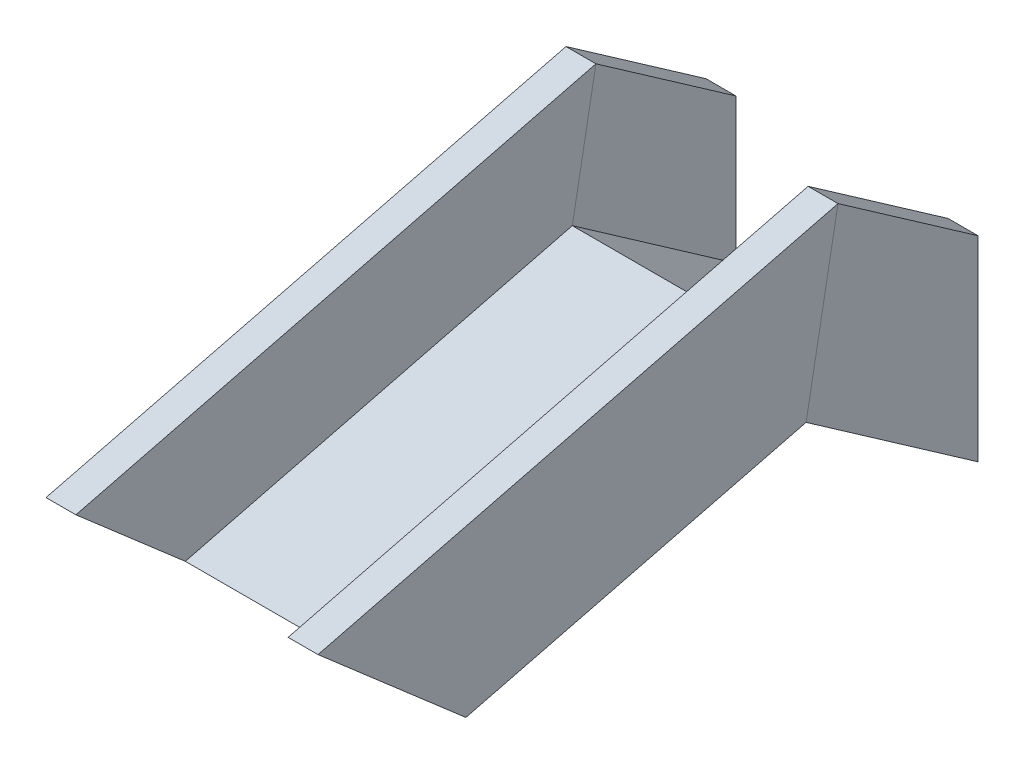
ISO-10303-21;
HEADER;
FILE_DESCRIPTION(('STEP AP214'),'2;1');
FILE_NAME('part.step','',(''),(''),'','','');
FILE_SCHEMA(('AUTOMOTIVE_DESIGN { 1 0 10303 214 1 1 1 1 }'));
ENDSEC;
DATA;
#1=APPLICATION_CONTEXT('core data for automotive mechanical design processes');
#2=APPLICATION_PROTOCOL_DEFINITION('international standard','automotive_design',2000,#1);
#3=PRODUCT_CONTEXT('',#1,'mechanical');
#4=PRODUCT('Part','Part','',(#3));
#5=PRODUCT_RELATED_PRODUCT_CATEGORY('part','',(#4));
#6=PRODUCT_DEFINITION_FORMATION('','',#4);
#7=PRODUCT_DEFINITION_CONTEXT('part definition',#1,'design');
#8=PRODUCT_DEFINITION('design','',#6,#7);
#9=PRODUCT_DEFINITION_SHAPE('','',#8);
#10=(LENGTH_UNIT() NAMED_UNIT(*) SI_UNIT(.MILLI.,.METRE.));
#11=(NAMED_UNIT(*) PLANE_ANGLE_UNIT() SI_UNIT($,.RADIAN.));
#12=(NAMED_UNIT(*) SI_UNIT($,.STERADIAN.) SOLID_ANGLE_UNIT());
#13=UNCERTAINTY_MEASURE_WITH_UNIT(LENGTH_MEASURE(1.E-05),#10,'distance_accuracy_value','');
#14=(GEOMETRIC_REPRESENTATION_CONTEXT(3) GLOBAL_UNCERTAINTY_ASSIGNED_CONTEXT((#13)) GLOBAL_UNIT_ASSIGNED_CONTEXT((#10,
#11,#12)) REPRESENTATION_CONTEXT('',''));
#15=CARTESIAN_POINT('',(0.,0.,0.));
#16=DIRECTION('',(0.,0.,1.));
#17=DIRECTION('',(1.,0.,0.));
#18=AXIS2_PLACEMENT_3D('',#15,#16,#17);
#19=CARTESIAN_POINT('',(0.,6.4741898096301,95.6456803790289));
#20=DIRECTION('',(0.,0.755161111248296,-0.655539240670029));
#21=DIRECTION('',(-1.,0.,0.));
#22=AXIS2_PLACEMENT_3D('',#19,#20,#21);
#23=PLANE('',#22);
#24=DIRECTION('',(1.,0.,0.));
#25=VECTOR('',#24,1.);
#26=CARTESIAN_POINT('',(50.8024068757048,6.4741898096301,95.6456803790289));
#27=LINE('',#26,#25);
#28=CARTESIAN_POINT('',(0.,6.4741898096301,95.6456803790289));
#29=VERTEX_POINT('',#28);
#30=CARTESIAN_POINT('',(50.8024068757048,6.4741898096301,95.6456803790289));
#31=VERTEX_POINT('',#30);
#32=EDGE_CURVE('E167',#29,#31,#27,.T.);
#33=ORIENTED_EDGE('',*,*,#32,.T.);
#34=DIRECTION('',(0.,0.655539240670029,0.755161111248296));
#35=VECTOR('',#34,1.);
#36=CARTESIAN_POINT('',(50.8024068757048,30.450040229435,123.265125139707));
#37=LINE('',#36,#35);
#38=CARTESIAN_POINT('',(50.8024068757048,30.450040229435,123.265125139707));
#39=VERTEX_POINT('',#38);
#40=EDGE_CURVE('E87',#31,#39,#37,.T.);
#41=ORIENTED_EDGE('',*,*,#40,.T.);
#42=DIRECTION('',(-1.,0.,0.));
#43=VECTOR('',#42,1.);
#44=CARTESIAN_POINT('',(45.2158879065551,30.450040229435,123.265125139707));
#45=LINE('',#44,#43);
#46=CARTESIAN_POINT('',(45.2158879065551,30.450040229435,123.265125139707));
#47=VERTEX_POINT('',#46);
#48=EDGE_CURVE('E83',#39,#47,#45,.T.);
#49=ORIENTED_EDGE('',*,*,#48,.T.);
#50=DIRECTION('',(0.,-0.655539240670029,-0.755161111248296));
#51=VECTOR('',#50,1.);
#52=CARTESIAN_POINT('',(45.2158879065551,12.7113442147822,102.830691068561));
#53=LINE('',#52,#51);
#54=CARTESIAN_POINT('',(45.2158879065551,12.7113442147822,102.830691068561));
#55=VERTEX_POINT('',#54);
#56=EDGE_CURVE('E177',#47,#55,#53,.T.);
#57=ORIENTED_EDGE('',*,*,#56,.T.);
#58=DIRECTION('',(-1.,0.,0.));
#59=VECTOR('',#58,1.);
#60=CARTESIAN_POINT('',(5.58651896914963,12.7113442147822,102.830691068561));
#61=LINE('',#60,#59);
#62=CARTESIAN_POINT('',(5.58651896914963,12.7113442147822,102.830691068561));
#63=VERTEX_POINT('',#62);
#64=EDGE_CURVE('E175',#55,#63,#61,.T.);
#65=ORIENTED_EDGE('',*,*,#64,.T.);
#66=DIRECTION('',(0.,0.655539240670029,0.755161111248296));
#67=VECTOR('',#66,1.);
#68=CARTESIAN_POINT('',(5.58651896914963,30.450040229435,123.265125139707));
#69=LINE('',#68,#67);
#70=CARTESIAN_POINT('',(5.58651896914963,30.450040229435,123.265125139707));
#71=VERTEX_POINT('',#70);
#72=EDGE_CURVE('E173',#63,#71,#69,.T.);
#73=ORIENTED_EDGE('',*,*,#72,.T.);
#74=DIRECTION('',(-1.,0.,0.));
#75=VECTOR('',#74,1.);
#76=CARTESIAN_POINT('',(0.,30.450040229435,123.265125139707));
#77=LINE('',#76,#75);
#78=CARTESIAN_POINT('',(0.,30.450040229435,123.265125139707));
#79=VERTEX_POINT('',#78);
#80=EDGE_CURVE('E171',#71,#79,#77,.T.);
#81=ORIENTED_EDGE('',*,*,#80,.T.);
#82=DIRECTION('',(0.,-0.655539240670029,-0.755161111248296));
#83=VECTOR('',#82,1.);
#84=CARTESIAN_POINT('',(0.,6.4741898096301,95.6456803790289));
#85=LINE('',#84,#83);
#86=EDGE_CURVE('E169',#79,#29,#85,.T.);
#87=ORIENTED_EDGE('',*,*,#86,.T.);
#88=EDGE_LOOP('',(#33,#41,#49,#57,#65,#73,#81,#87));
#89=FACE_BOUND('',#88,.T.);
#90=ADVANCED_FACE('F39',(#89),#23,.F.);
#91=CARTESIAN_POINT('',(0.,0.,0.));
#92=DIRECTION('',(0.,0.,-1.));
#93=DIRECTION('',(-1.,0.,0.));
#94=AXIS2_PLACEMENT_3D('',#91,#92,#93);
#95=PLANE('',#94);
#96=DIRECTION('',(1.,0.,0.));
#97=VECTOR('',#96,1.);
#98=CARTESIAN_POINT('',(50.8024068757048,0.,0.));
#99=LINE('',#98,#97);
#100=CARTESIAN_POINT('',(0.,0.,0.));
#101=VERTEX_POINT('',#100);
#102=CARTESIAN_POINT('',(50.8024068757048,0.,0.));
#103=VERTEX_POINT('',#102);
#104=EDGE_CURVE('E248',#101,#103,#99,.T.);
#105=ORIENTED_EDGE('',*,*,#104,.F.);
#106=DIRECTION('',(0.,-1.,0.));
#107=VECTOR('',#106,1.);
#108=CARTESIAN_POINT('',(0.,0.,0.));
#109=LINE('',#108,#107);
#110=CARTESIAN_POINT('',(0.,36.5742413761517,0.));
#111=VERTEX_POINT('',#110);
#112=EDGE_CURVE('E250',#111,#101,#109,.T.);
#113=ORIENTED_EDGE('',*,*,#112,.F.);
#114=DIRECTION('',(-1.,0.,0.));
#115=VECTOR('',#114,1.);
#116=CARTESIAN_POINT('',(0.,36.5742413761517,0.));
#117=LINE('',#116,#115);
#118=CARTESIAN_POINT('',(5.58651896914963,36.5742413761517,0.));
#119=VERTEX_POINT('',#118);
#120=EDGE_CURVE('E228',#119,#111,#117,.T.);
#121=ORIENTED_EDGE('',*,*,#120,.F.);
#122=DIRECTION('',(0.,1.,0.));
#123=VECTOR('',#122,1.);
#124=CARTESIAN_POINT('',(5.58651896914963,36.5742413761517,0.));
#125=LINE('',#124,#123);
#126=CARTESIAN_POINT('',(5.58651896914963,9.51454011933302,0.));
#127=VERTEX_POINT('',#126);
#128=EDGE_CURVE('E137',#127,#119,#125,.T.);
#129=ORIENTED_EDGE('',*,*,#128,.F.);
#130=DIRECTION('',(-1.,0.,0.));
#131=VECTOR('',#130,1.);
#132=CARTESIAN_POINT('',(5.58651896914963,9.51454011933302,0.));
#133=LINE('',#132,#131);
#134=CARTESIAN_POINT('',(45.2158879065551,9.51454011933302,0.));
#135=VERTEX_POINT('',#134);
#136=EDGE_CURVE('E133',#135,#127,#133,.T.);
#137=ORIENTED_EDGE('',*,*,#136,.F.);
#138=DIRECTION('',(0.,-1.,0.));
#139=VECTOR('',#138,1.);
#140=CARTESIAN_POINT('',(45.2158879065551,9.51454011933302,0.));
#141=LINE('',#140,#139);
#142=CARTESIAN_POINT('',(45.2158879065551,36.5742413761517,0.));
#143=VERTEX_POINT('',#142);
#144=EDGE_CURVE('E48',#143,#135,#141,.T.);
#145=ORIENTED_EDGE('',*,*,#144,.F.);
#146=DIRECTION('',(-1.,0.,0.));
#147=VECTOR('',#146,1.);
#148=CARTESIAN_POINT('',(45.2158879065551,36.5742413761517,0.));
#149=LINE('',#148,#147);
#150=CARTESIAN_POINT('',(50.8024068757048,36.5742413761517,0.));
#151=VERTEX_POINT('',#150);
#152=EDGE_CURVE('E11',#151,#143,#149,.T.);
#153=ORIENTED_EDGE('',*,*,#152,.F.);
#154=DIRECTION('',(0.,1.,0.));
#155=VECTOR('',#154,1.);
#156=CARTESIAN_POINT('',(50.8024068757048,36.5742413761517,0.));
#157=LINE('',#156,#155);
#158=EDGE_CURVE('E165',#103,#151,#157,.T.);
#159=ORIENTED_EDGE('',*,*,#158,.F.);
#160=EDGE_LOOP('',(#105,#113,#121,#129,#137,#145,#153,#159));
#161=FACE_BOUND('',#160,.T.);
#162=ADVANCED_FACE('F135',(#161),#95,.T.);
#163=CARTESIAN_POINT('',(45.2158879065551,55.708281623059,22.6881997631672));
#164=DIRECTION('',(0.,0.969883260893378,0.243570236767194));
#165=DIRECTION('',(0.,-0.243570236767194,0.969883260893378));
#166=AXIS2_PLACEMENT_3D('',#163,#164,#165);
#167=PLANE('',#166);
#168=DIRECTION('',(1.,0.,0.));
#169=VECTOR('',#168,1.);
#170=CARTESIAN_POINT('',(45.2158879065551,54.8406003500188,26.1432587789234));
#171=LINE('',#170,#169);
#172=CARTESIAN_POINT('',(45.2158879065551,54.8406003500188,26.1432587789234));
#173=VERTEX_POINT('',#172);
#174=CARTESIAN_POINT('',(50.8024068757048,54.8406003500188,26.1432587789234));
#175=VERTEX_POINT('',#174);
#176=EDGE_CURVE('E213',#173,#175,#171,.T.);
#177=ORIENTED_EDGE('',*,*,#176,.F.);
#178=DIRECTION('',(0.,-0.243570236767194,0.969883260893379));
#179=VECTOR('',#178,1.);
#180=CARTESIAN_POINT('',(45.2158879065551,55.708281623059,22.6881997631672));
#181=LINE('',#180,#179);
#182=EDGE_CURVE('E196',#173,#47,#181,.T.);
#183=ORIENTED_EDGE('',*,*,#182,.T.);
#184=ORIENTED_EDGE('',*,*,#48,.F.);
#185=DIRECTION('',(0.,-0.243570236767194,0.969883260893379));
#186=VECTOR('',#185,1.);
#187=CARTESIAN_POINT('',(50.8024068757048,55.708281623059,22.6881997631672));
#188=LINE('',#187,#186);
#189=EDGE_CURVE('E42',#175,#39,#188,.T.);
#190=ORIENTED_EDGE('',*,*,#189,.F.);
#191=EDGE_LOOP('',(#177,#183,#184,#190));
#192=FACE_BOUND('',#191,.T.);
#193=ADVANCED_FACE('F265',(#192),#167,.T.);
#194=CARTESIAN_POINT('',(45.2158879065551,37.9695856084062,2.25376569202107));
#195=DIRECTION('',(-1.,0.,0.));
#196=DIRECTION('',(0.,0.,1.));
#197=AXIS2_PLACEMENT_3D('',#194,#195,#196);
#198=PLANE('',#197);
#199=DIRECTION('',(0.,0.983500916523117,-0.180903143140714));
#200=VECTOR('',#199,1.);
#201=CARTESIAN_POINT('',(45.2158879065551,15.6492453309917,33.3520363080279));
#202=LINE('',#201,#200);
#203=CARTESIAN_POINT('',(45.2158879065551,30.8625125142997,30.5537391182));
#204=VERTEX_POINT('',#203);
#205=EDGE_CURVE('E235',#204,#173,#202,.T.);
#206=ORIENTED_EDGE('',*,*,#205,.F.);
#207=DIRECTION('',(0.,-0.243570236767194,0.969883260893379));
#208=VECTOR('',#207,1.);
#209=CARTESIAN_POINT('',(45.2158879065551,37.9695856084062,2.25376569202107));
#210=LINE('',#209,#208);
#211=EDGE_CURVE('E194',#204,#55,#210,.T.);
#212=ORIENTED_EDGE('',*,*,#211,.T.);
#213=ORIENTED_EDGE('',*,*,#56,.F.);
#214=ORIENTED_EDGE('',*,*,#182,.F.);
#215=EDGE_LOOP('',(#206,#212,#213,#214));
#216=FACE_BOUND('',#215,.T.);
#217=ADVANCED_FACE('F267',(#216),#198,.T.);
#218=CARTESIAN_POINT('',(5.58651896914963,37.9695856084062,2.25376569202107));
#219=DIRECTION('',(0.,0.969883260893378,0.243570236767194));
#220=DIRECTION('',(0.,-0.243570236767194,0.969883260893378));
#221=AXIS2_PLACEMENT_3D('',#218,#219,#220);
#222=PLANE('',#221);
#223=DIRECTION('',(1.,0.,0.));
#224=VECTOR('',#223,1.);
#225=CARTESIAN_POINT('',(5.58651896914963,30.8625125142997,30.5537391182));
#226=LINE('',#225,#224);
#227=CARTESIAN_POINT('',(5.58651896914963,30.8625125142997,30.5537391182));
#228=VERTEX_POINT('',#227);
#229=EDGE_CURVE('E154',#228,#204,#226,.T.);
#230=ORIENTED_EDGE('',*,*,#229,.F.);
#231=DIRECTION('',(0.,-0.243570236767194,0.969883260893379));
#232=VECTOR('',#231,1.);
#233=CARTESIAN_POINT('',(5.58651896914963,37.9695856084062,2.25376569202107));
#234=LINE('',#233,#232);
#235=EDGE_CURVE('E191',#228,#63,#234,.T.);
#236=ORIENTED_EDGE('',*,*,#235,.T.);
#237=ORIENTED_EDGE('',*,*,#64,.F.);
#238=ORIENTED_EDGE('',*,*,#211,.F.);
#239=EDGE_LOOP('',(#230,#236,#237,#238));
#240=FACE_BOUND('',#239,.T.);
#241=ADVANCED_FACE('F272',(#240),#222,.T.);
#242=CARTESIAN_POINT('',(5.58651896914963,55.708281623059,22.6881997631672));
#243=DIRECTION('',(1.,0.,0.));
#244=DIRECTION('',(0.,0.,-1.));
#245=AXIS2_PLACEMENT_3D('',#242,#243,#244);
#246=PLANE('',#245);
#247=DIRECTION('',(0.,-0.983500916523117,0.180903143140714));
#248=VECTOR('',#247,1.);
#249=CARTESIAN_POINT('',(5.58651896914963,41.823392233281,28.5376173643323));
#250=LINE('',#249,#248);
#251=CARTESIAN_POINT('',(5.58651896914963,54.8406003500188,26.1432587789234));
#252=VERTEX_POINT('',#251);
#253=EDGE_CURVE('E223',#252,#228,#250,.T.);
#254=ORIENTED_EDGE('',*,*,#253,.F.);
#255=DIRECTION('',(0.,-0.243570236767194,0.969883260893379));
#256=VECTOR('',#255,1.);
#257=CARTESIAN_POINT('',(5.58651896914963,55.708281623059,22.6881997631672));
#258=LINE('',#257,#256);
#259=EDGE_CURVE('E188',#252,#71,#258,.T.);
#260=ORIENTED_EDGE('',*,*,#259,.T.);
#261=ORIENTED_EDGE('',*,*,#72,.F.);
#262=ORIENTED_EDGE('',*,*,#235,.F.);
#263=EDGE_LOOP('',(#254,#260,#261,#262));
#264=FACE_BOUND('',#263,.T.);
#265=ADVANCED_FACE('F275',(#264),#246,.T.);
#266=CARTESIAN_POINT('',(0.,55.708281623059,22.6881997631672));
#267=DIRECTION('',(0.,0.969883260893378,0.243570236767194));
#268=DIRECTION('',(0.,-0.243570236767194,0.969883260893378));
#269=AXIS2_PLACEMENT_3D('',#266,#267,#268);
#270=PLANE('',#269);
#271=DIRECTION('',(1.,0.,0.));
#272=VECTOR('',#271,1.);
#273=CARTESIAN_POINT('',(0.,54.8406003500188,26.1432587789234));
#274=LINE('',#273,#272);
#275=CARTESIAN_POINT('',(0.,54.8406003500188,26.1432587789234));
#276=VERTEX_POINT('',#275);
#277=EDGE_CURVE('E209',#276,#252,#274,.T.);
#278=ORIENTED_EDGE('',*,*,#277,.F.);
#279=DIRECTION('',(0.,-0.243570236767194,0.969883260893379));
#280=VECTOR('',#279,1.);
#281=CARTESIAN_POINT('',(0.,55.708281623059,22.6881997631672));
#282=LINE('',#281,#280);
#283=EDGE_CURVE('E185',#276,#79,#282,.T.);
#284=ORIENTED_EDGE('',*,*,#283,.T.);
#285=ORIENTED_EDGE('',*,*,#80,.F.);
#286=ORIENTED_EDGE('',*,*,#259,.F.);
#287=EDGE_LOOP('',(#278,#284,#285,#286));
#288=FACE_BOUND('',#287,.T.);
#289=ADVANCED_FACE('F278',(#288),#270,.T.);
#290=CARTESIAN_POINT('',(0.,31.7324312032541,-4.93124499751095));
#291=DIRECTION('',(-1.,0.,0.));
#292=DIRECTION('',(0.,0.,1.));
#293=AXIS2_PLACEMENT_3D('',#290,#291,#292);
#294=PLANE('',#293);
#295=DIRECTION('',(0.,0.983500916523117,-0.180903143140714));
#296=VECTOR('',#295,1.);
#297=CARTESIAN_POINT('',(0.,6.44607754921905,35.0448481301661));
#298=LINE('',#297,#296);
#299=CARTESIAN_POINT('',(0.,22.4315074365791,32.1045209149133));
#300=VERTEX_POINT('',#299);
#301=EDGE_CURVE('E95',#300,#276,#298,.T.);
#302=ORIENTED_EDGE('',*,*,#301,.F.);
#303=DIRECTION('',(0.,-0.243570236767194,0.969883260893379));
#304=VECTOR('',#303,1.);
#305=CARTESIAN_POINT('',(0.,31.7324312032541,-4.93124499751095));
#306=LINE('',#305,#304);
#307=EDGE_CURVE('E183',#300,#29,#306,.T.);
#308=ORIENTED_EDGE('',*,*,#307,.T.);
#309=ORIENTED_EDGE('',*,*,#86,.F.);
#310=ORIENTED_EDGE('',*,*,#283,.F.);
#311=EDGE_LOOP('',(#302,#308,#309,#310));
#312=FACE_BOUND('',#311,.T.);
#313=ADVANCED_FACE('F279',(#312),#294,.T.);
#314=CARTESIAN_POINT('',(50.8024068757048,31.7324312032541,-4.93124499751095));
#315=DIRECTION('',(0.,-0.969883260893378,-0.243570236767194));
#316=DIRECTION('',(0.,0.243570236767194,-0.969883260893379));
#317=AXIS2_PLACEMENT_3D('',#314,#315,#316);
#318=PLANE('',#317);
#319=DIRECTION('',(1.,0.,0.));
#320=VECTOR('',#319,1.);
#321=CARTESIAN_POINT('',(50.8024068757048,22.4315074365791,32.1045209149133));
#322=LINE('',#321,#320);
#323=CARTESIAN_POINT('',(50.8024068757048,22.4315074365791,32.1045209149133));
#324=VERTEX_POINT('',#323);
#325=EDGE_CURVE('E240',#300,#324,#322,.T.);
#326=ORIENTED_EDGE('',*,*,#325,.T.);
#327=DIRECTION('',(0.,-0.243570236767194,0.969883260893379));
#328=VECTOR('',#327,1.);
#329=CARTESIAN_POINT('',(50.8024068757048,31.7324312032541,-4.93124499751095));
#330=LINE('',#329,#328);
#331=EDGE_CURVE('E180',#324,#31,#330,.T.);
#332=ORIENTED_EDGE('',*,*,#331,.T.);
#333=ORIENTED_EDGE('',*,*,#32,.F.);
#334=ORIENTED_EDGE('',*,*,#307,.F.);
#335=EDGE_LOOP('',(#326,#332,#333,#334));
#336=FACE_BOUND('',#335,.T.);
#337=ADVANCED_FACE('F262',(#336),#318,.T.);
#338=CARTESIAN_POINT('',(50.8024068757048,55.708281623059,22.6881997631672));
#339=DIRECTION('',(1.,0.,0.));
#340=DIRECTION('',(0.,1.,0.));
#341=AXIS2_PLACEMENT_3D('',#338,#339,#340);
#342=PLANE('',#341);
#343=DIRECTION('',(0.,-0.983500916523117,0.180903143140714));
#344=VECTOR('',#343,1.);
#345=CARTESIAN_POINT('',(50.8024068757048,41.823392233281,28.5376173643323));
#346=LINE('',#345,#344);
#347=EDGE_CURVE('E201',#175,#324,#346,.T.);
#348=ORIENTED_EDGE('',*,*,#347,.F.);
#349=ORIENTED_EDGE('',*,*,#189,.T.);
#350=ORIENTED_EDGE('',*,*,#40,.F.);
#351=ORIENTED_EDGE('',*,*,#331,.F.);
#352=EDGE_LOOP('',(#348,#349,#350,#351));
#353=FACE_BOUND('',#352,.T.);
#354=ADVANCED_FACE('F264',(#353),#342,.T.);
#355=CARTESIAN_POINT('',(50.8024068757048,0.,0.));
#356=DIRECTION('',(0.,-0.819731307048742,0.572748273017179));
#357=DIRECTION('',(0.,-0.572748273017179,-0.819731307048742));
#358=AXIS2_PLACEMENT_3D('',#355,#356,#357);
#359=PLANE('',#358);
#360=DIRECTION('',(0.,0.572748273017179,0.819731307048742));
#361=VECTOR('',#360,1.);
#362=CARTESIAN_POINT('',(50.8024068757048,0.,0.));
#363=LINE('',#362,#361);
#364=EDGE_CURVE('E237',#103,#324,#363,.T.);
#365=ORIENTED_EDGE('',*,*,#364,.T.);
#366=ORIENTED_EDGE('',*,*,#325,.F.);
#367=DIRECTION('',(0.,0.572748273017179,0.819731307048742));
#368=VECTOR('',#367,1.);
#369=CARTESIAN_POINT('',(0.,0.,0.));
#370=LINE('',#369,#368);
#371=EDGE_CURVE('E217',#101,#300,#370,.T.);
#372=ORIENTED_EDGE('',*,*,#371,.F.);
#373=ORIENTED_EDGE('',*,*,#104,.T.);
#374=EDGE_LOOP('',(#365,#366,#372,#373));
#375=FACE_BOUND('',#374,.T.);
#376=ADVANCED_FACE('F259',(#375),#359,.T.);
#377=CARTESIAN_POINT('',(45.2158879065551,36.5742413761517,0.));
#378=DIRECTION('',(0.,0.819731307048742,-0.572748273017179));
#379=DIRECTION('',(0.,0.572748273017179,0.819731307048742));
#380=AXIS2_PLACEMENT_3D('',#377,#378,#379);
#381=PLANE('',#380);
#382=DIRECTION('',(0.,0.572748273017179,0.819731307048742));
#383=VECTOR('',#382,1.);
#384=CARTESIAN_POINT('',(45.2158879065551,36.5742413761517,0.));
#385=LINE('',#384,#383);
#386=EDGE_CURVE('E150',#143,#173,#385,.T.);
#387=ORIENTED_EDGE('',*,*,#386,.T.);
#388=ORIENTED_EDGE('',*,*,#176,.T.);
#389=DIRECTION('',(0.,0.572748273017179,0.819731307048742));
#390=VECTOR('',#389,1.);
#391=CARTESIAN_POINT('',(50.8024068757048,36.5742413761517,0.));
#392=LINE('',#391,#390);
#393=EDGE_CURVE('E157',#151,#175,#392,.T.);
#394=ORIENTED_EDGE('',*,*,#393,.F.);
#395=ORIENTED_EDGE('',*,*,#152,.T.);
#396=EDGE_LOOP('',(#387,#388,#394,#395));
#397=FACE_BOUND('',#396,.T.);
#398=ADVANCED_FACE('F341',(#397),#381,.T.);
#399=CARTESIAN_POINT('',(45.2158879065551,9.51454011933302,0.));
#400=DIRECTION('',(-1.,0.,0.));
#401=DIRECTION('',(0.,0.,1.));
#402=AXIS2_PLACEMENT_3D('',#399,#400,#401);
#403=PLANE('',#402);
#404=DIRECTION('',(0.,0.572748273017179,0.819731307048742));
#405=VECTOR('',#404,1.);
#406=CARTESIAN_POINT('',(45.2158879065551,9.51454011933302,0.));
#407=LINE('',#406,#405);
#408=EDGE_CURVE('E148',#135,#204,#407,.T.);
#409=ORIENTED_EDGE('',*,*,#408,.T.);
#410=ORIENTED_EDGE('',*,*,#205,.T.);
#411=ORIENTED_EDGE('',*,*,#386,.F.);
#412=ORIENTED_EDGE('',*,*,#144,.T.);
#413=EDGE_LOOP('',(#409,#410,#411,#412));
#414=FACE_BOUND('',#413,.T.);
#415=ADVANCED_FACE('F146',(#414),#403,.T.);
#416=CARTESIAN_POINT('',(5.58651896914963,9.51454011933302,0.));
#417=DIRECTION('',(0.,0.819731307048742,-0.572748273017179));
#418=DIRECTION('',(0.,0.572748273017179,0.819731307048742));
#419=AXIS2_PLACEMENT_3D('',#416,#417,#418);
#420=PLANE('',#419);
#421=DIRECTION('',(0.,0.572748273017179,0.819731307048742));
#422=VECTOR('',#421,1.);
#423=CARTESIAN_POINT('',(5.58651896914963,9.51454011933302,0.));
#424=LINE('',#423,#422);
#425=EDGE_CURVE('E155',#127,#228,#424,.T.);
#426=ORIENTED_EDGE('',*,*,#425,.T.);
#427=ORIENTED_EDGE('',*,*,#229,.T.);
#428=ORIENTED_EDGE('',*,*,#408,.F.);
#429=ORIENTED_EDGE('',*,*,#136,.T.);
#430=EDGE_LOOP('',(#426,#427,#428,#429));
#431=FACE_BOUND('',#430,.T.);
#432=ADVANCED_FACE('F153',(#431),#420,.T.);
#433=CARTESIAN_POINT('',(5.58651896914963,36.5742413761517,0.));
#434=DIRECTION('',(1.,0.,0.));
#435=DIRECTION('',(0.,0.,-1.));
#436=AXIS2_PLACEMENT_3D('',#433,#434,#435);
#437=PLANE('',#436);
#438=DIRECTION('',(0.,0.572748273017179,0.819731307048742));
#439=VECTOR('',#438,1.);
#440=CARTESIAN_POINT('',(5.58651896914963,36.5742413761517,0.));
#441=LINE('',#440,#439);
#442=EDGE_CURVE('E159',#119,#252,#441,.T.);
#443=ORIENTED_EDGE('',*,*,#442,.T.);
#444=ORIENTED_EDGE('',*,*,#253,.T.);
#445=ORIENTED_EDGE('',*,*,#425,.F.);
#446=ORIENTED_EDGE('',*,*,#128,.T.);
#447=EDGE_LOOP('',(#443,#444,#445,#446));
#448=FACE_BOUND('',#447,.T.);
#449=ADVANCED_FACE('F222',(#448),#437,.T.);
#450=CARTESIAN_POINT('',(0.,36.5742413761517,0.));
#451=DIRECTION('',(0.,0.819731307048742,-0.572748273017179));
#452=DIRECTION('',(0.,0.572748273017179,0.819731307048742));
#453=AXIS2_PLACEMENT_3D('',#450,#451,#452);
#454=PLANE('',#453);
#455=DIRECTION('',(0.,0.572748273017179,0.819731307048742));
#456=VECTOR('',#455,1.);
#457=CARTESIAN_POINT('',(0.,36.5742413761517,0.));
#458=LINE('',#457,#456);
#459=EDGE_CURVE('E215',#111,#276,#458,.T.);
#460=ORIENTED_EDGE('',*,*,#459,.T.);
#461=ORIENTED_EDGE('',*,*,#277,.T.);
#462=ORIENTED_EDGE('',*,*,#442,.F.);
#463=ORIENTED_EDGE('',*,*,#120,.T.);
#464=EDGE_LOOP('',(#460,#461,#462,#463));
#465=FACE_BOUND('',#464,.T.);
#466=ADVANCED_FACE('F227',(#465),#454,.T.);
#467=CARTESIAN_POINT('',(0.,0.,0.));
#468=DIRECTION('',(-1.,0.,0.));
#469=DIRECTION('',(0.,0.,1.));
#470=AXIS2_PLACEMENT_3D('',#467,#468,#469);
#471=PLANE('',#470);
#472=ORIENTED_EDGE('',*,*,#371,.T.);
#473=ORIENTED_EDGE('',*,*,#301,.T.);
#474=ORIENTED_EDGE('',*,*,#459,.F.);
#475=ORIENTED_EDGE('',*,*,#112,.T.);
#476=EDGE_LOOP('',(#472,#473,#474,#475));
#477=FACE_BOUND('',#476,.T.);
#478=ADVANCED_FACE('F258',(#477),#471,.T.);
#479=CARTESIAN_POINT('',(50.8024068757048,36.5742413761517,0.));
#480=DIRECTION('',(1.,0.,0.));
#481=DIRECTION('',(0.,1.,0.));
#482=AXIS2_PLACEMENT_3D('',#479,#480,#481);
#483=PLANE('',#482);
#484=ORIENTED_EDGE('',*,*,#393,.T.);
#485=ORIENTED_EDGE('',*,*,#347,.T.);
#486=ORIENTED_EDGE('',*,*,#364,.F.);
#487=ORIENTED_EDGE('',*,*,#158,.T.);
#488=EDGE_LOOP('',(#484,#485,#486,#487));
#489=FACE_BOUND('',#488,.T.);
#490=ADVANCED_FACE('F288',(#489),#483,.T.);
#491=CLOSED_SHELL('',(#90,#162,#193,#217,#241,#265,#289,#313,#337,#354,#376,#398,#415,#432,#449,
#466,#478,#490));
#492=MANIFOLD_SOLID_BREP('B2',#491);
#493=ADVANCED_BREP_SHAPE_REPRESENTATION('',(#18,#492),#14);
#494=SHAPE_DEFINITION_REPRESENTATION(#9,#493);
ENDSEC;
END-ISO-10303-21;
